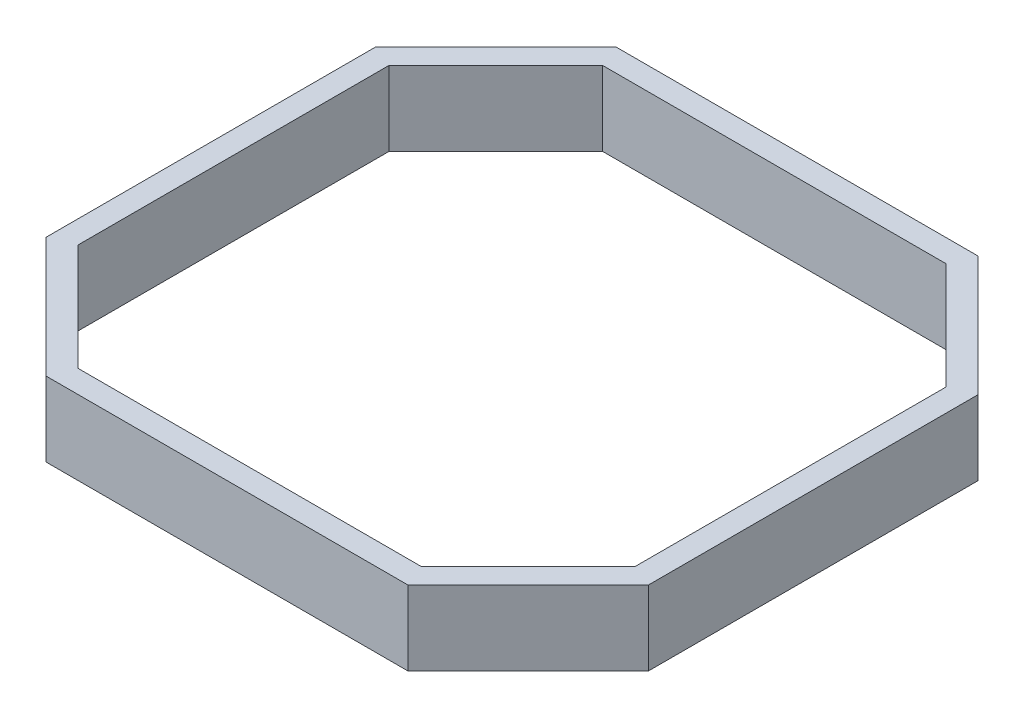
ISO-10303-21;
HEADER;
FILE_DESCRIPTION(('STEP AP214'),'2;1');
FILE_NAME('part.step','',(''),(''),'','','');
FILE_SCHEMA(('AUTOMOTIVE_DESIGN { 1 0 10303 214 1 1 1 1 }'));
ENDSEC;
DATA;
#1=APPLICATION_CONTEXT('core data for automotive mechanical design processes');
#2=APPLICATION_PROTOCOL_DEFINITION('international standard','automotive_design',2000,#1);
#3=PRODUCT_CONTEXT('',#1,'mechanical');
#4=PRODUCT('Part','Part','',(#3));
#5=PRODUCT_RELATED_PRODUCT_CATEGORY('part','',(#4));
#6=PRODUCT_DEFINITION_FORMATION('','',#4);
#7=PRODUCT_DEFINITION_CONTEXT('part definition',#1,'design');
#8=PRODUCT_DEFINITION('design','',#6,#7);
#9=PRODUCT_DEFINITION_SHAPE('','',#8);
#10=(LENGTH_UNIT() NAMED_UNIT(*) SI_UNIT(.MILLI.,.METRE.));
#11=(NAMED_UNIT(*) PLANE_ANGLE_UNIT() SI_UNIT($,.RADIAN.));
#12=(NAMED_UNIT(*) SI_UNIT($,.STERADIAN.) SOLID_ANGLE_UNIT());
#13=UNCERTAINTY_MEASURE_WITH_UNIT(LENGTH_MEASURE(1.E-05),#10,'distance_accuracy_value','');
#14=(GEOMETRIC_REPRESENTATION_CONTEXT(3) GLOBAL_UNCERTAINTY_ASSIGNED_CONTEXT((#13)) GLOBAL_UNIT_ASSIGNED_CONTEXT((#10,
#11,#12)) REPRESENTATION_CONTEXT('',''));
#15=CARTESIAN_POINT('',(0.,0.,0.));
#16=DIRECTION('',(0.,0.,1.));
#17=DIRECTION('',(1.,0.,0.));
#18=AXIS2_PLACEMENT_3D('',#15,#16,#17);
#19=CARTESIAN_POINT('',(0.,11.5,0.));
#20=DIRECTION('',(0.,-1.,0.));
#21=DIRECTION('',(0.,0.,-1.));
#22=AXIS2_PLACEMENT_3D('',#19,#20,#21);
#23=PLANE('',#22);
#24=DIRECTION('',(0.,0.,1.));
#25=VECTOR('',#24,1.);
#26=CARTESIAN_POINT('',(-46.5,11.5,25.4497474683058));
#27=LINE('',#26,#25);
#28=CARTESIAN_POINT('',(-46.5,11.5,-25.4497474683058));
#29=VERTEX_POINT('',#28);
#30=CARTESIAN_POINT('',(-46.5,11.5,25.4497474683058));
#31=VERTEX_POINT('',#30);
#32=EDGE_CURVE('E213',#29,#31,#27,.T.);
#33=ORIENTED_EDGE('',*,*,#32,.T.);
#34=DIRECTION('',(0.707106781186548,0.,0.707106781186547));
#35=VECTOR('',#34,1.);
#36=CARTESIAN_POINT('',(-46.5,11.5,25.4497474683058));
#37=LINE('',#36,#35);
#38=CARTESIAN_POINT('',(-27.9497474683058,11.5,44.));
#39=VERTEX_POINT('',#38);
#40=EDGE_CURVE('E216',#31,#39,#37,.T.);
#41=ORIENTED_EDGE('',*,*,#40,.T.);
#42=DIRECTION('',(1.,0.,0.));
#43=VECTOR('',#42,1.);
#44=CARTESIAN_POINT('',(-27.9497474683058,11.5,44.));
#45=LINE('',#44,#43);
#46=CARTESIAN_POINT('',(27.9497474683058,11.5,44.));
#47=VERTEX_POINT('',#46);
#48=EDGE_CURVE('E219',#39,#47,#45,.T.);
#49=ORIENTED_EDGE('',*,*,#48,.T.);
#50=DIRECTION('',(0.707106781186547,0.,-0.707106781186548));
#51=VECTOR('',#50,1.);
#52=CARTESIAN_POINT('',(27.9497474683058,11.5,44.));
#53=LINE('',#52,#51);
#54=CARTESIAN_POINT('',(46.5,11.5,25.4497474683058));
#55=VERTEX_POINT('',#54);
#56=EDGE_CURVE('E221',#47,#55,#53,.T.);
#57=ORIENTED_EDGE('',*,*,#56,.T.);
#58=DIRECTION('',(0.,0.,-1.));
#59=VECTOR('',#58,1.);
#60=CARTESIAN_POINT('',(46.5,11.5,25.4497474683058));
#61=LINE('',#60,#59);
#62=CARTESIAN_POINT('',(46.5,11.5,-25.4497474683058));
#63=VERTEX_POINT('',#62);
#64=EDGE_CURVE('E223',#55,#63,#61,.T.);
#65=ORIENTED_EDGE('',*,*,#64,.T.);
#66=DIRECTION('',(-0.707106781186547,0.,-0.707106781186548));
#67=VECTOR('',#66,1.);
#68=CARTESIAN_POINT('',(27.9497474683058,11.5,-44.));
#69=LINE('',#68,#67);
#70=CARTESIAN_POINT('',(27.9497474683058,11.5,-44.));
#71=VERTEX_POINT('',#70);
#72=EDGE_CURVE('E225',#63,#71,#69,.T.);
#73=ORIENTED_EDGE('',*,*,#72,.T.);
#74=DIRECTION('',(-1.,0.,0.));
#75=VECTOR('',#74,1.);
#76=CARTESIAN_POINT('',(-27.9497474683058,11.5,-44.));
#77=LINE('',#76,#75);
#78=CARTESIAN_POINT('',(-27.9497474683058,11.5,-44.));
#79=VERTEX_POINT('',#78);
#80=EDGE_CURVE('E227',#71,#79,#77,.T.);
#81=ORIENTED_EDGE('',*,*,#80,.T.);
#82=DIRECTION('',(-0.707106781186547,0.,0.707106781186548));
#83=VECTOR('',#82,1.);
#84=CARTESIAN_POINT('',(-46.5,11.5,-25.4497474683058));
#85=LINE('',#84,#83);
#86=EDGE_CURVE('E229',#79,#29,#85,.T.);
#87=ORIENTED_EDGE('',*,*,#86,.T.);
#88=EDGE_LOOP('',(#33,#41,#49,#57,#65,#73,#81,#87));
#89=FACE_BOUND('',#88,.T.);
#90=DIRECTION('',(0.,0.,1.));
#91=VECTOR('',#90,1.);
#92=CARTESIAN_POINT('',(-43.,11.5,24.));
#93=LINE('',#92,#91);
#94=CARTESIAN_POINT('',(-43.,11.5,-24.));
#95=VERTEX_POINT('',#94);
#96=CARTESIAN_POINT('',(-43.,11.5,24.));
#97=VERTEX_POINT('',#96);
#98=EDGE_CURVE('E148',#95,#97,#93,.T.);
#99=ORIENTED_EDGE('',*,*,#98,.F.);
#100=DIRECTION('',(-0.707106781186547,0.,0.707106781186547));
#101=VECTOR('',#100,1.);
#102=CARTESIAN_POINT('',(-43.,11.5,-24.));
#103=LINE('',#102,#101);
#104=CARTESIAN_POINT('',(-26.5,11.5,-40.5));
#105=VERTEX_POINT('',#104);
#106=EDGE_CURVE('E181',#105,#95,#103,.T.);
#107=ORIENTED_EDGE('',*,*,#106,.F.);
#108=DIRECTION('',(-1.,0.,0.));
#109=VECTOR('',#108,1.);
#110=CARTESIAN_POINT('',(-26.5,11.5,-40.5));
#111=LINE('',#110,#109);
#112=CARTESIAN_POINT('',(26.5,11.5,-40.5));
#113=VERTEX_POINT('',#112);
#114=EDGE_CURVE('E179',#113,#105,#111,.T.);
#115=ORIENTED_EDGE('',*,*,#114,.F.);
#116=DIRECTION('',(-0.707106781186547,0.,-0.707106781186547));
#117=VECTOR('',#116,1.);
#118=CARTESIAN_POINT('',(26.5,11.5,-40.5));
#119=LINE('',#118,#117);
#120=CARTESIAN_POINT('',(43.,11.5,-24.));
#121=VERTEX_POINT('',#120);
#122=EDGE_CURVE('E177',#121,#113,#119,.T.);
#123=ORIENTED_EDGE('',*,*,#122,.F.);
#124=DIRECTION('',(0.,0.,-1.));
#125=VECTOR('',#124,1.);
#126=CARTESIAN_POINT('',(43.,11.5,24.));
#127=LINE('',#126,#125);
#128=CARTESIAN_POINT('',(43.,11.5,24.));
#129=VERTEX_POINT('',#128);
#130=EDGE_CURVE('E175',#129,#121,#127,.T.);
#131=ORIENTED_EDGE('',*,*,#130,.F.);
#132=DIRECTION('',(0.707106781186547,0.,-0.707106781186547));
#133=VECTOR('',#132,1.);
#134=CARTESIAN_POINT('',(26.5,11.5,40.5));
#135=LINE('',#134,#133);
#136=CARTESIAN_POINT('',(26.5,11.5,40.5));
#137=VERTEX_POINT('',#136);
#138=EDGE_CURVE('E171',#137,#129,#135,.T.);
#139=ORIENTED_EDGE('',*,*,#138,.F.);
#140=DIRECTION('',(1.,0.,0.));
#141=VECTOR('',#140,1.);
#142=CARTESIAN_POINT('',(-26.5,11.5,40.5));
#143=LINE('',#142,#141);
#144=CARTESIAN_POINT('',(-26.5,11.5,40.5));
#145=VERTEX_POINT('',#144);
#146=EDGE_CURVE('E169',#145,#137,#143,.T.);
#147=ORIENTED_EDGE('',*,*,#146,.F.);
#148=DIRECTION('',(0.707106781186548,0.,0.707106781186547));
#149=VECTOR('',#148,1.);
#150=CARTESIAN_POINT('',(-43.,11.5,24.));
#151=LINE('',#150,#149);
#152=EDGE_CURVE('E156',#97,#145,#151,.T.);
#153=ORIENTED_EDGE('',*,*,#152,.F.);
#154=EDGE_LOOP('',(#99,#107,#115,#123,#131,#139,#147,#153));
#155=FACE_BOUND('',#154,.T.);
#156=ADVANCED_FACE('F35',(#89,#155),#23,.F.);
#157=CARTESIAN_POINT('',(0.,0.,0.));
#158=DIRECTION('',(0.,-1.,0.));
#159=DIRECTION('',(0.,0.,-1.));
#160=AXIS2_PLACEMENT_3D('',#157,#158,#159);
#161=PLANE('',#160);
#162=DIRECTION('',(0.,0.,1.));
#163=VECTOR('',#162,1.);
#164=CARTESIAN_POINT('',(-46.5,0.,25.4497474683058));
#165=LINE('',#164,#163);
#166=CARTESIAN_POINT('',(-46.5,0.,-25.4497474683058));
#167=VERTEX_POINT('',#166);
#168=CARTESIAN_POINT('',(-46.5,0.,25.4497474683058));
#169=VERTEX_POINT('',#168);
#170=EDGE_CURVE('E164',#167,#169,#165,.T.);
#171=ORIENTED_EDGE('',*,*,#170,.F.);
#172=DIRECTION('',(-0.707106781186547,0.,0.707106781186548));
#173=VECTOR('',#172,1.);
#174=CARTESIAN_POINT('',(-46.5,0.,-25.4497474683058));
#175=LINE('',#174,#173);
#176=CARTESIAN_POINT('',(-27.9497474683058,0.,-44.));
#177=VERTEX_POINT('',#176);
#178=EDGE_CURVE('E217',#177,#167,#175,.T.);
#179=ORIENTED_EDGE('',*,*,#178,.F.);
#180=DIRECTION('',(-1.,0.,0.));
#181=VECTOR('',#180,1.);
#182=CARTESIAN_POINT('',(-27.9497474683058,0.,-44.));
#183=LINE('',#182,#181);
#184=CARTESIAN_POINT('',(27.9497474683058,0.,-44.));
#185=VERTEX_POINT('',#184);
#186=EDGE_CURVE('E244',#185,#177,#183,.T.);
#187=ORIENTED_EDGE('',*,*,#186,.F.);
#188=DIRECTION('',(-0.707106781186547,0.,-0.707106781186548));
#189=VECTOR('',#188,1.);
#190=CARTESIAN_POINT('',(27.9497474683058,0.,-44.));
#191=LINE('',#190,#189);
#192=CARTESIAN_POINT('',(46.5,0.,-25.4497474683058));
#193=VERTEX_POINT('',#192);
#194=EDGE_CURVE('E242',#193,#185,#191,.T.);
#195=ORIENTED_EDGE('',*,*,#194,.F.);
#196=DIRECTION('',(0.,0.,-1.));
#197=VECTOR('',#196,1.);
#198=CARTESIAN_POINT('',(46.5,0.,25.4497474683058));
#199=LINE('',#198,#197);
#200=CARTESIAN_POINT('',(46.5,0.,25.4497474683058));
#201=VERTEX_POINT('',#200);
#202=EDGE_CURVE('E240',#201,#193,#199,.T.);
#203=ORIENTED_EDGE('',*,*,#202,.F.);
#204=DIRECTION('',(0.707106781186547,0.,-0.707106781186548));
#205=VECTOR('',#204,1.);
#206=CARTESIAN_POINT('',(27.9497474683058,0.,44.));
#207=LINE('',#206,#205);
#208=CARTESIAN_POINT('',(27.9497474683058,0.,44.));
#209=VERTEX_POINT('',#208);
#210=EDGE_CURVE('E238',#209,#201,#207,.T.);
#211=ORIENTED_EDGE('',*,*,#210,.F.);
#212=DIRECTION('',(1.,0.,0.));
#213=VECTOR('',#212,1.);
#214=CARTESIAN_POINT('',(-27.9497474683058,0.,44.));
#215=LINE('',#214,#213);
#216=CARTESIAN_POINT('',(-27.9497474683058,0.,44.));
#217=VERTEX_POINT('',#216);
#218=EDGE_CURVE('E236',#217,#209,#215,.T.);
#219=ORIENTED_EDGE('',*,*,#218,.F.);
#220=DIRECTION('',(0.707106781186548,0.,0.707106781186547));
#221=VECTOR('',#220,1.);
#222=CARTESIAN_POINT('',(-46.5,0.,25.4497474683058));
#223=LINE('',#222,#221);
#224=EDGE_CURVE('E234',#169,#217,#223,.T.);
#225=ORIENTED_EDGE('',*,*,#224,.F.);
#226=EDGE_LOOP('',(#171,#179,#187,#195,#203,#211,#219,#225));
#227=FACE_BOUND('',#226,.T.);
#228=DIRECTION('',(-0.707106781186547,0.,0.707106781186547));
#229=VECTOR('',#228,1.);
#230=CARTESIAN_POINT('',(-43.,0.,-24.));
#231=LINE('',#230,#229);
#232=CARTESIAN_POINT('',(-26.5,0.,-40.5));
#233=VERTEX_POINT('',#232);
#234=CARTESIAN_POINT('',(-43.,0.,-24.));
#235=VERTEX_POINT('',#234);
#236=EDGE_CURVE('E157',#233,#235,#231,.T.);
#237=ORIENTED_EDGE('',*,*,#236,.T.);
#238=DIRECTION('',(0.,0.,1.));
#239=VECTOR('',#238,1.);
#240=CARTESIAN_POINT('',(-43.,0.,24.));
#241=LINE('',#240,#239);
#242=CARTESIAN_POINT('',(-43.,0.,24.));
#243=VERTEX_POINT('',#242);
#244=EDGE_CURVE('E58',#235,#243,#241,.T.);
#245=ORIENTED_EDGE('',*,*,#244,.T.);
#246=DIRECTION('',(0.707106781186548,0.,0.707106781186547));
#247=VECTOR('',#246,1.);
#248=CARTESIAN_POINT('',(-43.,0.,24.));
#249=LINE('',#248,#247);
#250=CARTESIAN_POINT('',(-26.5,0.,40.5));
#251=VERTEX_POINT('',#250);
#252=EDGE_CURVE('E163',#243,#251,#249,.T.);
#253=ORIENTED_EDGE('',*,*,#252,.T.);
#254=DIRECTION('',(1.,0.,0.));
#255=VECTOR('',#254,1.);
#256=CARTESIAN_POINT('',(-26.5,0.,40.5));
#257=LINE('',#256,#255);
#258=CARTESIAN_POINT('',(26.5,0.,40.5));
#259=VERTEX_POINT('',#258);
#260=EDGE_CURVE('E185',#251,#259,#257,.T.);
#261=ORIENTED_EDGE('',*,*,#260,.T.);
#262=DIRECTION('',(0.707106781186547,0.,-0.707106781186547));
#263=VECTOR('',#262,1.);
#264=CARTESIAN_POINT('',(26.5,0.,40.5));
#265=LINE('',#264,#263);
#266=CARTESIAN_POINT('',(43.,0.,24.));
#267=VERTEX_POINT('',#266);
#268=EDGE_CURVE('E188',#259,#267,#265,.T.);
#269=ORIENTED_EDGE('',*,*,#268,.T.);
#270=DIRECTION('',(0.,0.,-1.));
#271=VECTOR('',#270,1.);
#272=CARTESIAN_POINT('',(43.,0.,24.));
#273=LINE('',#272,#271);
#274=CARTESIAN_POINT('',(43.,0.,-24.));
#275=VERTEX_POINT('',#274);
#276=EDGE_CURVE('E191',#267,#275,#273,.T.);
#277=ORIENTED_EDGE('',*,*,#276,.T.);
#278=DIRECTION('',(-0.707106781186547,0.,-0.707106781186547));
#279=VECTOR('',#278,1.);
#280=CARTESIAN_POINT('',(26.5,0.,-40.5));
#281=LINE('',#280,#279);
#282=CARTESIAN_POINT('',(26.5,0.,-40.5));
#283=VERTEX_POINT('',#282);
#284=EDGE_CURVE('E194',#275,#283,#281,.T.);
#285=ORIENTED_EDGE('',*,*,#284,.T.);
#286=DIRECTION('',(-1.,0.,0.));
#287=VECTOR('',#286,1.);
#288=CARTESIAN_POINT('',(-26.5,0.,-40.5));
#289=LINE('',#288,#287);
#290=EDGE_CURVE('E197',#283,#233,#289,.T.);
#291=ORIENTED_EDGE('',*,*,#290,.T.);
#292=EDGE_LOOP('',(#237,#245,#253,#261,#269,#277,#285,#291));
#293=FACE_BOUND('',#292,.T.);
#294=ADVANCED_FACE('F274',(#227,#293),#161,.T.);
#295=CARTESIAN_POINT('',(-46.5,11.5,25.4497474683058));
#296=DIRECTION('',(1.,0.,0.));
#297=DIRECTION('',(0.,0.,-1.));
#298=AXIS2_PLACEMENT_3D('',#295,#296,#297);
#299=PLANE('',#298);
#300=ORIENTED_EDGE('',*,*,#170,.T.);
#301=DIRECTION('',(0.,-1.,0.));
#302=VECTOR('',#301,1.);
#303=CARTESIAN_POINT('',(-46.5,11.5,25.4497474683058));
#304=LINE('',#303,#302);
#305=EDGE_CURVE('E11',#31,#169,#304,.T.);
#306=ORIENTED_EDGE('',*,*,#305,.F.);
#307=ORIENTED_EDGE('',*,*,#32,.F.);
#308=DIRECTION('',(0.,-1.,0.));
#309=VECTOR('',#308,1.);
#310=CARTESIAN_POINT('',(-46.5,11.5,-25.4497474683058));
#311=LINE('',#310,#309);
#312=EDGE_CURVE('E231',#29,#167,#311,.T.);
#313=ORIENTED_EDGE('',*,*,#312,.T.);
#314=EDGE_LOOP('',(#300,#306,#307,#313));
#315=FACE_BOUND('',#314,.T.);
#316=ADVANCED_FACE('F37',(#315),#299,.F.);
#317=CARTESIAN_POINT('',(-46.5,11.5,25.4497474683058));
#318=DIRECTION('',(0.707106781186547,0.,-0.707106781186548));
#319=DIRECTION('',(-0.707106781186548,0.,-0.707106781186547));
#320=AXIS2_PLACEMENT_3D('',#317,#318,#319);
#321=PLANE('',#320);
#322=ORIENTED_EDGE('',*,*,#224,.T.);
#323=DIRECTION('',(0.,-1.,0.));
#324=VECTOR('',#323,1.);
#325=CARTESIAN_POINT('',(-27.9497474683058,11.5,44.));
#326=LINE('',#325,#324);
#327=EDGE_CURVE('E43',#39,#217,#326,.T.);
#328=ORIENTED_EDGE('',*,*,#327,.F.);
#329=ORIENTED_EDGE('',*,*,#40,.F.);
#330=ORIENTED_EDGE('',*,*,#305,.T.);
#331=EDGE_LOOP('',(#322,#328,#329,#330));
#332=FACE_BOUND('',#331,.T.);
#333=ADVANCED_FACE('F291',(#332),#321,.F.);
#334=CARTESIAN_POINT('',(-27.9497474683058,11.5,44.));
#335=DIRECTION('',(0.,0.,-1.));
#336=DIRECTION('',(-1.,0.,0.));
#337=AXIS2_PLACEMENT_3D('',#334,#335,#336);
#338=PLANE('',#337);
#339=ORIENTED_EDGE('',*,*,#218,.T.);
#340=DIRECTION('',(0.,-1.,0.));
#341=VECTOR('',#340,1.);
#342=CARTESIAN_POINT('',(27.9497474683058,11.5,44.));
#343=LINE('',#342,#341);
#344=EDGE_CURVE('E261',#47,#209,#343,.T.);
#345=ORIENTED_EDGE('',*,*,#344,.F.);
#346=ORIENTED_EDGE('',*,*,#48,.F.);
#347=ORIENTED_EDGE('',*,*,#327,.T.);
#348=EDGE_LOOP('',(#339,#345,#346,#347));
#349=FACE_BOUND('',#348,.T.);
#350=ADVANCED_FACE('F268',(#349),#338,.F.);
#351=CARTESIAN_POINT('',(27.9497474683058,11.5,44.));
#352=DIRECTION('',(-0.707106781186548,0.,-0.707106781186547));
#353=DIRECTION('',(-0.707106781186547,0.,0.707106781186548));
#354=AXIS2_PLACEMENT_3D('',#351,#352,#353);
#355=PLANE('',#354);
#356=ORIENTED_EDGE('',*,*,#210,.T.);
#357=DIRECTION('',(0.,-1.,0.));
#358=VECTOR('',#357,1.);
#359=CARTESIAN_POINT('',(46.5,11.5,25.4497474683058));
#360=LINE('',#359,#358);
#361=EDGE_CURVE('E258',#55,#201,#360,.T.);
#362=ORIENTED_EDGE('',*,*,#361,.F.);
#363=ORIENTED_EDGE('',*,*,#56,.F.);
#364=ORIENTED_EDGE('',*,*,#344,.T.);
#365=EDGE_LOOP('',(#356,#362,#363,#364));
#366=FACE_BOUND('',#365,.T.);
#367=ADVANCED_FACE('F280',(#366),#355,.F.);
#368=CARTESIAN_POINT('',(46.5,11.5,25.4497474683058));
#369=DIRECTION('',(-1.,0.,0.));
#370=DIRECTION('',(0.,0.,1.));
#371=AXIS2_PLACEMENT_3D('',#368,#369,#370);
#372=PLANE('',#371);
#373=ORIENTED_EDGE('',*,*,#202,.T.);
#374=DIRECTION('',(0.,-1.,0.));
#375=VECTOR('',#374,1.);
#376=CARTESIAN_POINT('',(46.5,11.5,-25.4497474683058));
#377=LINE('',#376,#375);
#378=EDGE_CURVE('E255',#63,#193,#377,.T.);
#379=ORIENTED_EDGE('',*,*,#378,.F.);
#380=ORIENTED_EDGE('',*,*,#64,.F.);
#381=ORIENTED_EDGE('',*,*,#361,.T.);
#382=EDGE_LOOP('',(#373,#379,#380,#381));
#383=FACE_BOUND('',#382,.T.);
#384=ADVANCED_FACE('F284',(#383),#372,.F.);
#385=CARTESIAN_POINT('',(27.9497474683058,11.5,-44.));
#386=DIRECTION('',(-0.707106781186548,0.,0.707106781186547));
#387=DIRECTION('',(0.707106781186547,0.,0.707106781186548));
#388=AXIS2_PLACEMENT_3D('',#385,#386,#387);
#389=PLANE('',#388);
#390=ORIENTED_EDGE('',*,*,#194,.T.);
#391=DIRECTION('',(0.,-1.,0.));
#392=VECTOR('',#391,1.);
#393=CARTESIAN_POINT('',(27.9497474683058,11.5,-44.));
#394=LINE('',#393,#392);
#395=EDGE_CURVE('E252',#71,#185,#394,.T.);
#396=ORIENTED_EDGE('',*,*,#395,.F.);
#397=ORIENTED_EDGE('',*,*,#72,.F.);
#398=ORIENTED_EDGE('',*,*,#378,.T.);
#399=EDGE_LOOP('',(#390,#396,#397,#398));
#400=FACE_BOUND('',#399,.T.);
#401=ADVANCED_FACE('F304',(#400),#389,.F.);
#402=CARTESIAN_POINT('',(-27.9497474683058,11.5,-44.));
#403=DIRECTION('',(0.,0.,1.));
#404=DIRECTION('',(1.,0.,0.));
#405=AXIS2_PLACEMENT_3D('',#402,#403,#404);
#406=PLANE('',#405);
#407=ORIENTED_EDGE('',*,*,#186,.T.);
#408=DIRECTION('',(0.,-1.,0.));
#409=VECTOR('',#408,1.);
#410=CARTESIAN_POINT('',(-27.9497474683058,11.5,-44.));
#411=LINE('',#410,#409);
#412=EDGE_CURVE('E249',#79,#177,#411,.T.);
#413=ORIENTED_EDGE('',*,*,#412,.F.);
#414=ORIENTED_EDGE('',*,*,#80,.F.);
#415=ORIENTED_EDGE('',*,*,#395,.T.);
#416=EDGE_LOOP('',(#407,#413,#414,#415));
#417=FACE_BOUND('',#416,.T.);
#418=ADVANCED_FACE('F302',(#417),#406,.F.);
#419=CARTESIAN_POINT('',(-46.5,11.5,-25.4497474683058));
#420=DIRECTION('',(0.707106781186548,0.,0.707106781186547));
#421=DIRECTION('',(0.707106781186547,0.,-0.707106781186548));
#422=AXIS2_PLACEMENT_3D('',#419,#420,#421);
#423=PLANE('',#422);
#424=ORIENTED_EDGE('',*,*,#178,.T.);
#425=ORIENTED_EDGE('',*,*,#312,.F.);
#426=ORIENTED_EDGE('',*,*,#86,.F.);
#427=ORIENTED_EDGE('',*,*,#412,.T.);
#428=EDGE_LOOP('',(#424,#425,#426,#427));
#429=FACE_BOUND('',#428,.T.);
#430=ADVANCED_FACE('F297',(#429),#423,.F.);
#431=CARTESIAN_POINT('',(-43.,11.5,24.));
#432=DIRECTION('',(1.,0.,0.));
#433=DIRECTION('',(0.,0.,-1.));
#434=AXIS2_PLACEMENT_3D('',#431,#432,#433);
#435=PLANE('',#434);
#436=ORIENTED_EDGE('',*,*,#244,.F.);
#437=DIRECTION('',(0.,-1.,0.));
#438=VECTOR('',#437,1.);
#439=CARTESIAN_POINT('',(-43.,11.5,-24.));
#440=LINE('',#439,#438);
#441=EDGE_CURVE('E152',#95,#235,#440,.T.);
#442=ORIENTED_EDGE('',*,*,#441,.F.);
#443=ORIENTED_EDGE('',*,*,#98,.T.);
#444=DIRECTION('',(0.,-1.,0.));
#445=VECTOR('',#444,1.);
#446=CARTESIAN_POINT('',(-43.,11.5,24.));
#447=LINE('',#446,#445);
#448=EDGE_CURVE('E151',#97,#243,#447,.T.);
#449=ORIENTED_EDGE('',*,*,#448,.T.);
#450=EDGE_LOOP('',(#436,#442,#443,#449));
#451=FACE_BOUND('',#450,.T.);
#452=ADVANCED_FACE('F150',(#451),#435,.T.);
#453=CARTESIAN_POINT('',(-43.,11.5,24.));
#454=DIRECTION('',(0.707106781186547,0.,-0.707106781186548));
#455=DIRECTION('',(-0.707106781186548,0.,-0.707106781186547));
#456=AXIS2_PLACEMENT_3D('',#453,#454,#455);
#457=PLANE('',#456);
#458=ORIENTED_EDGE('',*,*,#252,.F.);
#459=ORIENTED_EDGE('',*,*,#448,.F.);
#460=ORIENTED_EDGE('',*,*,#152,.T.);
#461=DIRECTION('',(0.,-1.,0.));
#462=VECTOR('',#461,1.);
#463=CARTESIAN_POINT('',(-26.5,11.5,40.5));
#464=LINE('',#463,#462);
#465=EDGE_CURVE('E165',#145,#251,#464,.T.);
#466=ORIENTED_EDGE('',*,*,#465,.T.);
#467=EDGE_LOOP('',(#458,#459,#460,#466));
#468=FACE_BOUND('',#467,.T.);
#469=ADVANCED_FACE('F160',(#468),#457,.T.);
#470=CARTESIAN_POINT('',(-26.5,11.5,40.5));
#471=DIRECTION('',(0.,0.,-1.));
#472=DIRECTION('',(-1.,0.,0.));
#473=AXIS2_PLACEMENT_3D('',#470,#471,#472);
#474=PLANE('',#473);
#475=ORIENTED_EDGE('',*,*,#260,.F.);
#476=ORIENTED_EDGE('',*,*,#465,.F.);
#477=ORIENTED_EDGE('',*,*,#146,.T.);
#478=DIRECTION('',(0.,-1.,0.));
#479=VECTOR('',#478,1.);
#480=CARTESIAN_POINT('',(26.5,11.5,40.5));
#481=LINE('',#480,#479);
#482=EDGE_CURVE('E210',#137,#259,#481,.T.);
#483=ORIENTED_EDGE('',*,*,#482,.T.);
#484=EDGE_LOOP('',(#475,#476,#477,#483));
#485=FACE_BOUND('',#484,.T.);
#486=ADVANCED_FACE('F329',(#485),#474,.T.);
#487=CARTESIAN_POINT('',(26.5,11.5,40.5));
#488=DIRECTION('',(-0.707106781186548,0.,-0.707106781186548));
#489=DIRECTION('',(-0.707106781186547,0.,0.707106781186548));
#490=AXIS2_PLACEMENT_3D('',#487,#488,#489);
#491=PLANE('',#490);
#492=ORIENTED_EDGE('',*,*,#268,.F.);
#493=ORIENTED_EDGE('',*,*,#482,.F.);
#494=ORIENTED_EDGE('',*,*,#138,.T.);
#495=DIRECTION('',(0.,-1.,0.));
#496=VECTOR('',#495,1.);
#497=CARTESIAN_POINT('',(43.,11.5,24.));
#498=LINE('',#497,#496);
#499=EDGE_CURVE('E208',#129,#267,#498,.T.);
#500=ORIENTED_EDGE('',*,*,#499,.T.);
#501=EDGE_LOOP('',(#492,#493,#494,#500));
#502=FACE_BOUND('',#501,.T.);
#503=ADVANCED_FACE('F333',(#502),#491,.T.);
#504=CARTESIAN_POINT('',(43.,11.5,24.));
#505=DIRECTION('',(-1.,0.,0.));
#506=DIRECTION('',(0.,0.,1.));
#507=AXIS2_PLACEMENT_3D('',#504,#505,#506);
#508=PLANE('',#507);
#509=ORIENTED_EDGE('',*,*,#276,.F.);
#510=ORIENTED_EDGE('',*,*,#499,.F.);
#511=ORIENTED_EDGE('',*,*,#130,.T.);
#512=DIRECTION('',(0.,-1.,0.));
#513=VECTOR('',#512,1.);
#514=CARTESIAN_POINT('',(43.,11.5,-24.));
#515=LINE('',#514,#513);
#516=EDGE_CURVE('E206',#121,#275,#515,.T.);
#517=ORIENTED_EDGE('',*,*,#516,.T.);
#518=EDGE_LOOP('',(#509,#510,#511,#517));
#519=FACE_BOUND('',#518,.T.);
#520=ADVANCED_FACE('F339',(#519),#508,.T.);
#521=CARTESIAN_POINT('',(26.5,11.5,-40.5));
#522=DIRECTION('',(-0.707106781186548,0.,0.707106781186548));
#523=DIRECTION('',(0.707106781186547,0.,0.707106781186548));
#524=AXIS2_PLACEMENT_3D('',#521,#522,#523);
#525=PLANE('',#524);
#526=ORIENTED_EDGE('',*,*,#284,.F.);
#527=ORIENTED_EDGE('',*,*,#516,.F.);
#528=ORIENTED_EDGE('',*,*,#122,.T.);
#529=DIRECTION('',(0.,-1.,0.));
#530=VECTOR('',#529,1.);
#531=CARTESIAN_POINT('',(26.5,11.5,-40.5));
#532=LINE('',#531,#530);
#533=EDGE_CURVE('E204',#113,#283,#532,.T.);
#534=ORIENTED_EDGE('',*,*,#533,.T.);
#535=EDGE_LOOP('',(#526,#527,#528,#534));
#536=FACE_BOUND('',#535,.T.);
#537=ADVANCED_FACE('F343',(#536),#525,.T.);
#538=CARTESIAN_POINT('',(-26.5,11.5,-40.5));
#539=DIRECTION('',(0.,0.,1.));
#540=DIRECTION('',(1.,0.,0.));
#541=AXIS2_PLACEMENT_3D('',#538,#539,#540);
#542=PLANE('',#541);
#543=ORIENTED_EDGE('',*,*,#290,.F.);
#544=ORIENTED_EDGE('',*,*,#533,.F.);
#545=ORIENTED_EDGE('',*,*,#114,.T.);
#546=DIRECTION('',(0.,-1.,0.));
#547=VECTOR('',#546,1.);
#548=CARTESIAN_POINT('',(-26.5,11.5,-40.5));
#549=LINE('',#548,#547);
#550=EDGE_CURVE('E50',#105,#233,#549,.T.);
#551=ORIENTED_EDGE('',*,*,#550,.T.);
#552=EDGE_LOOP('',(#543,#544,#545,#551));
#553=FACE_BOUND('',#552,.T.);
#554=ADVANCED_FACE('F347',(#553),#542,.T.);
#555=CARTESIAN_POINT('',(-43.,11.5,-24.));
#556=DIRECTION('',(0.707106781186548,0.,0.707106781186548));
#557=DIRECTION('',(0.707106781186547,0.,-0.707106781186548));
#558=AXIS2_PLACEMENT_3D('',#555,#556,#557);
#559=PLANE('',#558);
#560=ORIENTED_EDGE('',*,*,#236,.F.);
#561=ORIENTED_EDGE('',*,*,#550,.F.);
#562=ORIENTED_EDGE('',*,*,#106,.T.);
#563=ORIENTED_EDGE('',*,*,#441,.T.);
#564=EDGE_LOOP('',(#560,#561,#562,#563));
#565=FACE_BOUND('',#564,.T.);
#566=ADVANCED_FACE('F351',(#565),#559,.T.);
#567=CLOSED_SHELL('',(#156,#294,#316,#333,#350,#367,#384,#401,#418,#430,#452,#469,#486,#503,
#520,#537,#554,#566));
#568=MANIFOLD_SOLID_BREP('B2',#567);
#569=ADVANCED_BREP_SHAPE_REPRESENTATION('',(#18,#568),#14);
#570=SHAPE_DEFINITION_REPRESENTATION(#9,#569);
ENDSEC;
END-ISO-10303-21;
